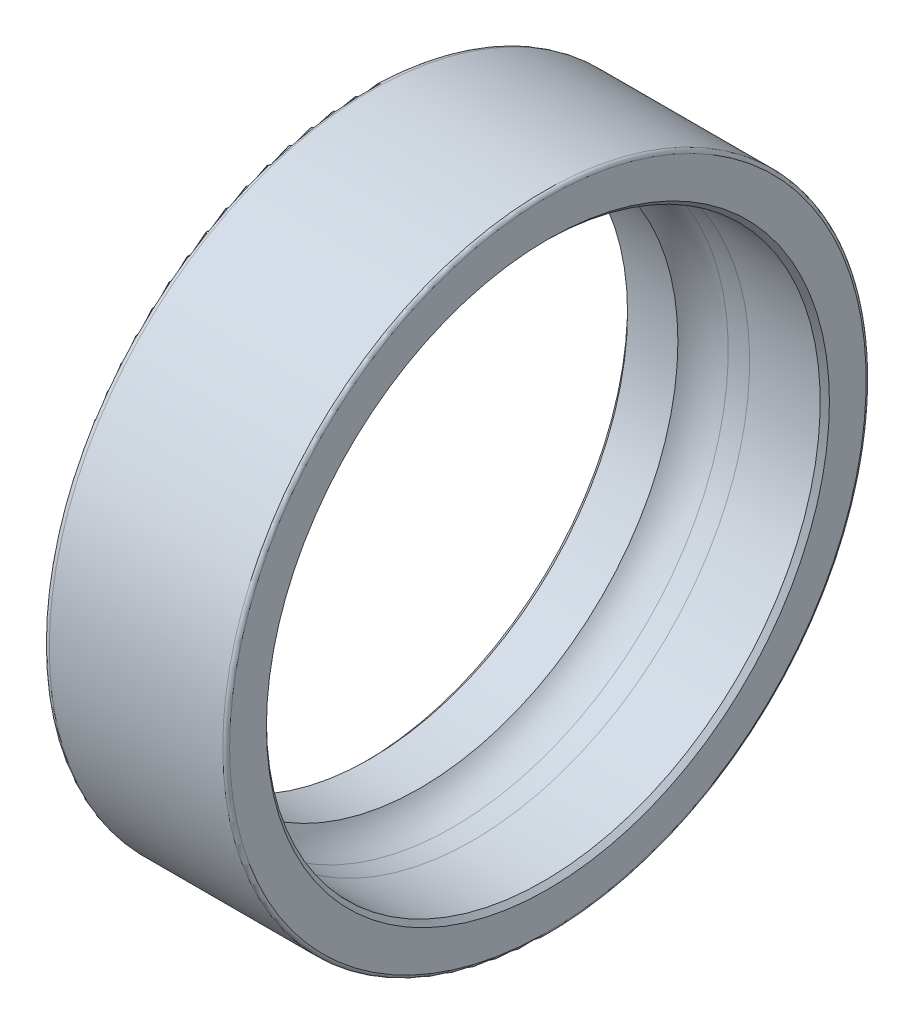
ISO-10303-21;
HEADER;
FILE_DESCRIPTION(('STEP AP214'),'2;1');
FILE_NAME('part.step','',(''),(''),'','','');
FILE_SCHEMA(('AUTOMOTIVE_DESIGN { 1 0 10303 214 1 1 1 1 }'));
ENDSEC;
DATA;
#1=APPLICATION_CONTEXT('core data for automotive mechanical design processes');
#2=APPLICATION_PROTOCOL_DEFINITION('international standard','automotive_design',2000,#1);
#3=PRODUCT_CONTEXT('',#1,'mechanical');
#4=PRODUCT('Part','Part','',(#3));
#5=PRODUCT_RELATED_PRODUCT_CATEGORY('part','',(#4));
#6=PRODUCT_DEFINITION_FORMATION('','',#4);
#7=PRODUCT_DEFINITION_CONTEXT('part definition',#1,'design');
#8=PRODUCT_DEFINITION('design','',#6,#7);
#9=PRODUCT_DEFINITION_SHAPE('','',#8);
#10=(LENGTH_UNIT() NAMED_UNIT(*) SI_UNIT(.MILLI.,.METRE.));
#11=(NAMED_UNIT(*) PLANE_ANGLE_UNIT() SI_UNIT($,.RADIAN.));
#12=(NAMED_UNIT(*) SI_UNIT($,.STERADIAN.) SOLID_ANGLE_UNIT());
#13=UNCERTAINTY_MEASURE_WITH_UNIT(LENGTH_MEASURE(1.E-05),#10,'distance_accuracy_value','');
#14=(GEOMETRIC_REPRESENTATION_CONTEXT(3) GLOBAL_UNCERTAINTY_ASSIGNED_CONTEXT((#13)) GLOBAL_UNIT_ASSIGNED_CONTEXT((#10,
#11,#12)) REPRESENTATION_CONTEXT('',''));
#15=CARTESIAN_POINT('',(0.,0.,0.));
#16=DIRECTION('',(0.,0.,1.));
#17=DIRECTION('',(1.,0.,0.));
#18=AXIS2_PLACEMENT_3D('',#15,#16,#17);
#19=CARTESIAN_POINT('',(-4.,13.7,0.));
#20=DIRECTION('',(1.,0.,0.));
#21=DIRECTION('',(0.,0.,-1.));
#22=AXIS2_PLACEMENT_3D('',#19,#20,#21);
#23=PLANE('',#22);
#24=CARTESIAN_POINT('',(-4.,0.,0.));
#25=DIRECTION('',(-1.,0.,0.));
#26=DIRECTION('',(0.,0.,1.));
#27=AXIS2_PLACEMENT_3D('',#24,#25,#26);
#28=CIRCLE('',#27,11.465);
#29=CARTESIAN_POINT('',(-4.,0.,11.465));
#30=VERTEX_POINT('',#29);
#31=EDGE_CURVE('E67',#30,#30,#28,.T.);
#32=ORIENTED_EDGE('',*,*,#31,.F.);
#33=EDGE_LOOP('',(#32));
#34=FACE_BOUND('',#33,.T.);
#35=CARTESIAN_POINT('',(-4.,0.,0.));
#36=DIRECTION('',(-1.,0.,0.));
#37=DIRECTION('',(0.,0.,1.));
#38=AXIS2_PLACEMENT_3D('',#35,#36,#37);
#39=CIRCLE('',#38,13.7);
#40=CARTESIAN_POINT('',(-4.,0.,13.7));
#41=VERTEX_POINT('',#40);
#42=EDGE_CURVE('E10',#41,#41,#39,.T.);
#43=ORIENTED_EDGE('',*,*,#42,.T.);
#44=EDGE_LOOP('',(#43));
#45=FACE_BOUND('',#44,.T.);
#46=ADVANCED_FACE('F30',(#34,#45),#23,.F.);
#47=CARTESIAN_POINT('',(-3.70000000000012,0.,0.));
#48=DIRECTION('',(-1.,0.,0.));
#49=DIRECTION('',(0.,0.,1.));
#50=AXIS2_PLACEMENT_3D('',#47,#48,#49);
#51=TOROIDAL_SURFACE('',#50,13.7000000000001,0.299999999999878);
#52=ORIENTED_EDGE('',*,*,#42,.F.);
#53=EDGE_LOOP('',(#52));
#54=FACE_BOUND('',#53,.T.);
#55=CARTESIAN_POINT('',(-3.7,0.,0.));
#56=DIRECTION('',(-1.,0.,0.));
#57=DIRECTION('',(0.,0.,1.));
#58=AXIS2_PLACEMENT_3D('',#55,#56,#57);
#59=CIRCLE('',#58,14.);
#60=CARTESIAN_POINT('',(-3.7,0.,14.));
#61=VERTEX_POINT('',#60);
#62=EDGE_CURVE('E36',#61,#61,#59,.T.);
#63=ORIENTED_EDGE('',*,*,#62,.T.);
#64=EDGE_LOOP('',(#63));
#65=FACE_BOUND('',#64,.T.);
#66=ADVANCED_FACE('F74',(#54,#65),#51,.T.);
#67=CARTESIAN_POINT('',(4.,0.,0.));
#68=DIRECTION('',(-1.,0.,0.));
#69=DIRECTION('',(0.,0.,1.));
#70=AXIS2_PLACEMENT_3D('',#67,#68,#69);
#71=CYLINDRICAL_SURFACE('',#70,14.);
#72=ORIENTED_EDGE('',*,*,#62,.F.);
#73=EDGE_LOOP('',(#72));
#74=FACE_BOUND('',#73,.T.);
#75=CARTESIAN_POINT('',(3.85,0.,0.));
#76=DIRECTION('',(-1.,0.,0.));
#77=DIRECTION('',(0.,0.,1.));
#78=AXIS2_PLACEMENT_3D('',#75,#76,#77);
#79=CIRCLE('',#78,14.);
#80=CARTESIAN_POINT('',(3.85,0.,14.));
#81=VERTEX_POINT('',#80);
#82=EDGE_CURVE('E40',#81,#81,#79,.T.);
#83=ORIENTED_EDGE('',*,*,#82,.T.);
#84=EDGE_LOOP('',(#83));
#85=FACE_BOUND('',#84,.T.);
#86=ADVANCED_FACE('F78',(#74,#85),#71,.T.);
#87=CARTESIAN_POINT('',(3.85000000000006,0.,0.));
#88=DIRECTION('',(-1.,0.,0.));
#89=DIRECTION('',(0.,0.,1.));
#90=AXIS2_PLACEMENT_3D('',#87,#88,#89);
#91=TOROIDAL_SURFACE('',#90,13.8500000000001,0.14999999999994);
#92=ORIENTED_EDGE('',*,*,#82,.F.);
#93=EDGE_LOOP('',(#92));
#94=FACE_BOUND('',#93,.T.);
#95=CARTESIAN_POINT('',(4.,0.,0.));
#96=DIRECTION('',(-1.,0.,0.));
#97=DIRECTION('',(0.,0.,1.));
#98=AXIS2_PLACEMENT_3D('',#95,#96,#97);
#99=CIRCLE('',#98,13.85);
#100=CARTESIAN_POINT('',(4.,0.,13.85));
#101=VERTEX_POINT('',#100);
#102=EDGE_CURVE('E44',#101,#101,#99,.T.);
#103=ORIENTED_EDGE('',*,*,#102,.T.);
#104=EDGE_LOOP('',(#103));
#105=FACE_BOUND('',#104,.T.);
#106=ADVANCED_FACE('F83',(#94,#105),#91,.T.);
#107=CARTESIAN_POINT('',(4.,12.25,0.));
#108=DIRECTION('',(-1.,0.,0.));
#109=DIRECTION('',(0.,0.,1.));
#110=AXIS2_PLACEMENT_3D('',#107,#108,#109);
#111=PLANE('',#110);
#112=ORIENTED_EDGE('',*,*,#102,.F.);
#113=EDGE_LOOP('',(#112));
#114=FACE_BOUND('',#113,.T.);
#115=CARTESIAN_POINT('',(4.,0.,0.));
#116=DIRECTION('',(-1.,0.,0.));
#117=DIRECTION('',(0.,0.,1.));
#118=AXIS2_PLACEMENT_3D('',#115,#116,#117);
#119=CIRCLE('',#118,12.25);
#120=CARTESIAN_POINT('',(4.,0.,12.25));
#121=VERTEX_POINT('',#120);
#122=EDGE_CURVE('E49',#121,#121,#119,.T.);
#123=ORIENTED_EDGE('',*,*,#122,.T.);
#124=EDGE_LOOP('',(#123));
#125=FACE_BOUND('',#124,.T.);
#126=ADVANCED_FACE('F89',(#114,#125),#111,.F.);
#127=CARTESIAN_POINT('',(3.8,0.,0.));
#128=DIRECTION('',(1.,0.,0.));
#129=DIRECTION('',(0.,0.,-1.));
#130=AXIS2_PLACEMENT_3D('',#127,#128,#129);
#131=CONICAL_SURFACE('',#130,12.05,0.785398163397449);
#132=ORIENTED_EDGE('',*,*,#122,.F.);
#133=EDGE_LOOP('',(#132));
#134=FACE_BOUND('',#133,.T.);
#135=CARTESIAN_POINT('',(3.8,0.,0.));
#136=DIRECTION('',(-1.,0.,0.));
#137=DIRECTION('',(0.,0.,1.));
#138=AXIS2_PLACEMENT_3D('',#135,#136,#137);
#139=CIRCLE('',#138,12.05);
#140=CARTESIAN_POINT('',(3.8,0.,12.05));
#141=VERTEX_POINT('',#140);
#142=EDGE_CURVE('E52',#141,#141,#139,.T.);
#143=ORIENTED_EDGE('',*,*,#142,.T.);
#144=EDGE_LOOP('',(#143));
#145=FACE_BOUND('',#144,.T.);
#146=ADVANCED_FACE('F93',(#134,#145),#131,.F.);
#147=CARTESIAN_POINT('',(4.,0.,0.));
#148=DIRECTION('',(-1.,0.,0.));
#149=DIRECTION('',(0.,0.,1.));
#150=AXIS2_PLACEMENT_3D('',#147,#148,#149);
#151=CYLINDRICAL_SURFACE('',#150,12.05);
#152=ORIENTED_EDGE('',*,*,#142,.F.);
#153=EDGE_LOOP('',(#152));
#154=FACE_BOUND('',#153,.T.);
#155=CARTESIAN_POINT('',(0.72825306515416,0.,0.));
#156=DIRECTION('',(-1.,0.,0.));
#157=DIRECTION('',(0.,0.,1.));
#158=AXIS2_PLACEMENT_3D('',#155,#156,#157);
#159=CIRCLE('',#158,12.05);
#160=CARTESIAN_POINT('',(0.72825306515416,0.,12.05));
#161=VERTEX_POINT('',#160);
#162=EDGE_CURVE('E55',#161,#161,#159,.T.);
#163=ORIENTED_EDGE('',*,*,#162,.T.);
#164=EDGE_LOOP('',(#163));
#165=FACE_BOUND('',#164,.T.);
#166=ADVANCED_FACE('F97',(#154,#165),#151,.F.);
#167=CARTESIAN_POINT('',(-0.14122186498805,0.,0.));
#168=DIRECTION('',(1.,0.,0.));
#169=DIRECTION('',(0.,0.,-1.));
#170=AXIS2_PLACEMENT_3D('',#167,#168,#169);
#171=CONICAL_SURFACE('',#170,11.987968775922,0.0712226409053972);
#172=ORIENTED_EDGE('',*,*,#162,.F.);
#173=EDGE_LOOP('',(#172));
#174=FACE_BOUND('',#173,.T.);
#175=CARTESIAN_POINT('',(-0.14122186498805,0.,0.));
#176=DIRECTION('',(-1.,0.,0.));
#177=DIRECTION('',(0.,0.,1.));
#178=AXIS2_PLACEMENT_3D('',#175,#176,#177);
#179=CIRCLE('',#178,11.987968775922);
#180=CARTESIAN_POINT('',(-0.14122186498805,0.,11.987968775922));
#181=VERTEX_POINT('',#180);
#182=EDGE_CURVE('E58',#181,#181,#179,.T.);
#183=ORIENTED_EDGE('',*,*,#182,.T.);
#184=EDGE_LOOP('',(#183));
#185=FACE_BOUND('',#184,.T.);
#186=ADVANCED_FACE('F101',(#174,#185),#171,.F.);
#187=CARTESIAN_POINT('',(-5.95877513998033E-13,0.,0.));
#188=DIRECTION('',(-1.,0.,0.));
#189=DIRECTION('',(0.,0.,1.));
#190=AXIS2_PLACEMENT_3D('',#187,#188,#189);
#191=TOROIDAL_SURFACE('',#190,10.0085000000016,1.98449999999858);
#192=ORIENTED_EDGE('',*,*,#182,.F.);
#193=EDGE_LOOP('',(#192));
#194=FACE_BOUND('',#193,.T.);
#195=CARTESIAN_POINT('',(-1.5679183652219,0.,0.));
#196=DIRECTION('',(-1.,0.,0.));
#197=DIRECTION('',(0.,0.,1.));
#198=AXIS2_PLACEMENT_3D('',#195,#196,#197);
#199=CIRCLE('',#198,11.225);
#200=CARTESIAN_POINT('',(-1.5679183652219,0.,11.225));
#201=VERTEX_POINT('',#200);
#202=EDGE_CURVE('E61',#201,#201,#199,.T.);
#203=ORIENTED_EDGE('',*,*,#202,.T.);
#204=EDGE_LOOP('',(#203));
#205=FACE_BOUND('',#204,.T.);
#206=ADVANCED_FACE('F105',(#194,#205),#191,.F.);
#207=CARTESIAN_POINT('',(4.,0.,0.));
#208=DIRECTION('',(-1.,0.,0.));
#209=DIRECTION('',(0.,0.,1.));
#210=AXIS2_PLACEMENT_3D('',#207,#208,#209);
#211=CYLINDRICAL_SURFACE('',#210,11.225);
#212=ORIENTED_EDGE('',*,*,#202,.F.);
#213=EDGE_LOOP('',(#212));
#214=FACE_BOUND('',#213,.T.);
#215=CARTESIAN_POINT('',(-3.76,0.,0.));
#216=DIRECTION('',(-1.,0.,0.));
#217=DIRECTION('',(0.,0.,1.));
#218=AXIS2_PLACEMENT_3D('',#215,#216,#217);
#219=CIRCLE('',#218,11.225);
#220=CARTESIAN_POINT('',(-3.76,0.,11.225));
#221=VERTEX_POINT('',#220);
#222=EDGE_CURVE('E64',#221,#221,#219,.T.);
#223=ORIENTED_EDGE('',*,*,#222,.T.);
#224=EDGE_LOOP('',(#223));
#225=FACE_BOUND('',#224,.T.);
#226=ADVANCED_FACE('F109',(#214,#225),#211,.F.);
#227=CARTESIAN_POINT('',(-4.,0.,0.));
#228=DIRECTION('',(-1.,0.,0.));
#229=DIRECTION('',(0.,0.,1.));
#230=AXIS2_PLACEMENT_3D('',#227,#228,#229);
#231=CONICAL_SURFACE('',#230,11.465,0.785398163397445);
#232=ORIENTED_EDGE('',*,*,#222,.F.);
#233=EDGE_LOOP('',(#232));
#234=FACE_BOUND('',#233,.T.);
#235=ORIENTED_EDGE('',*,*,#31,.T.);
#236=EDGE_LOOP('',(#235));
#237=FACE_BOUND('',#236,.T.);
#238=ADVANCED_FACE('F71',(#234,#237),#231,.F.);
#239=CLOSED_SHELL('',(#46,#66,#86,#106,#126,#146,#166,#186,#206,#226,#238));
#240=MANIFOLD_SOLID_BREP('B2',#239);
#241=ADVANCED_BREP_SHAPE_REPRESENTATION('',(#18,#240),#14);
#242=SHAPE_DEFINITION_REPRESENTATION(#9,#241);
ENDSEC;
END-ISO-10303-21;
